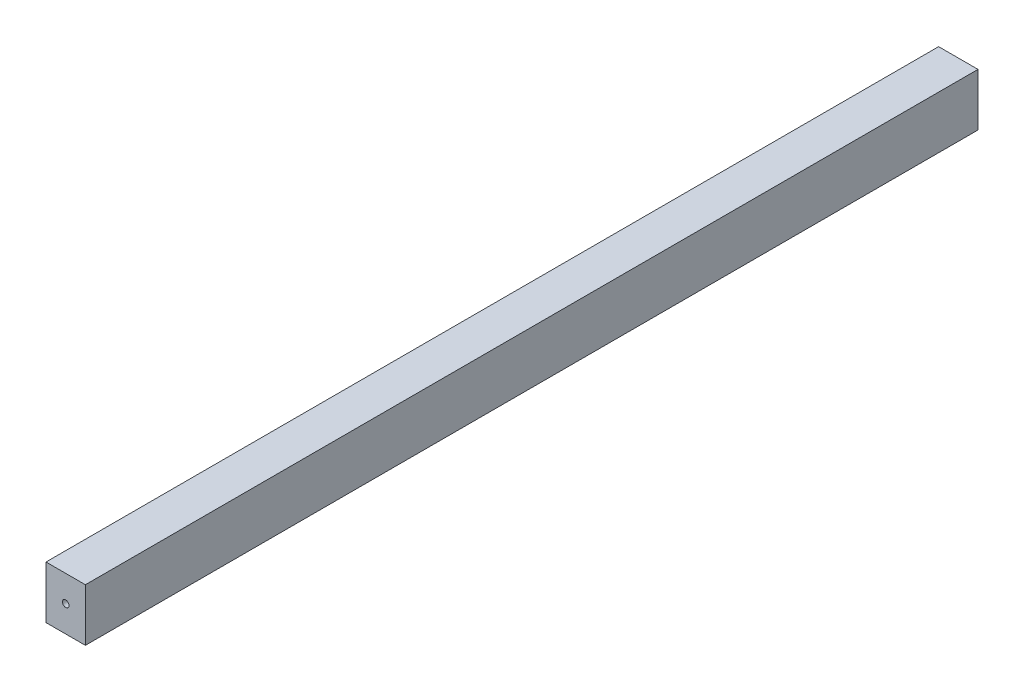
ISO-10303-21;
HEADER;
FILE_DESCRIPTION(('STEP AP214'),'2;1');
FILE_NAME('part.step','',(''),(''),'','','');
FILE_SCHEMA(('AUTOMOTIVE_DESIGN { 1 0 10303 214 1 1 1 1 }'));
ENDSEC;
DATA;
#1=APPLICATION_CONTEXT('core data for automotive mechanical design processes');
#2=APPLICATION_PROTOCOL_DEFINITION('international standard','automotive_design',2000,#1);
#3=PRODUCT_CONTEXT('',#1,'mechanical');
#4=PRODUCT('Part','Part','',(#3));
#5=PRODUCT_RELATED_PRODUCT_CATEGORY('part','',(#4));
#6=PRODUCT_DEFINITION_FORMATION('','',#4);
#7=PRODUCT_DEFINITION_CONTEXT('part definition',#1,'design');
#8=PRODUCT_DEFINITION('design','',#6,#7);
#9=PRODUCT_DEFINITION_SHAPE('','',#8);
#10=(LENGTH_UNIT() NAMED_UNIT(*) SI_UNIT(.MILLI.,.METRE.));
#11=(NAMED_UNIT(*) PLANE_ANGLE_UNIT() SI_UNIT($,.RADIAN.));
#12=(NAMED_UNIT(*) SI_UNIT($,.STERADIAN.) SOLID_ANGLE_UNIT());
#13=UNCERTAINTY_MEASURE_WITH_UNIT(LENGTH_MEASURE(1.E-05),#10,'distance_accuracy_value','');
#14=(GEOMETRIC_REPRESENTATION_CONTEXT(3) GLOBAL_UNCERTAINTY_ASSIGNED_CONTEXT((#13)) GLOBAL_UNIT_ASSIGNED_CONTEXT((#10,
#11,#12)) REPRESENTATION_CONTEXT('',''));
#15=CARTESIAN_POINT('',(0.,0.,0.));
#16=DIRECTION('',(0.,0.,1.));
#17=DIRECTION('',(1.,0.,0.));
#18=AXIS2_PLACEMENT_3D('',#15,#16,#17);
#19=CARTESIAN_POINT('',(0.,0.,863.6));
#20=DIRECTION('',(0.,0.,-1.));
#21=DIRECTION('',(-1.,0.,0.));
#22=AXIS2_PLACEMENT_3D('',#19,#20,#21);
#23=PLANE('',#22);
#24=DIRECTION('',(0.,-1.,0.));
#25=VECTOR('',#24,1.);
#26=CARTESIAN_POINT('',(0.,0.,863.6));
#27=LINE('',#26,#25);
#28=CARTESIAN_POINT('',(0.,50.8,863.6));
#29=VERTEX_POINT('',#28);
#30=CARTESIAN_POINT('',(0.,0.,863.6));
#31=VERTEX_POINT('',#30);
#32=EDGE_CURVE('E92',#29,#31,#27,.T.);
#33=ORIENTED_EDGE('',*,*,#32,.T.);
#34=DIRECTION('',(1.,0.,0.));
#35=VECTOR('',#34,1.);
#36=CARTESIAN_POINT('',(0.,0.,863.6));
#37=LINE('',#36,#35);
#38=CARTESIAN_POINT('',(38.1,0.,863.6));
#39=VERTEX_POINT('',#38);
#40=EDGE_CURVE('E87',#31,#39,#37,.T.);
#41=ORIENTED_EDGE('',*,*,#40,.T.);
#42=DIRECTION('',(0.,1.,0.));
#43=VECTOR('',#42,1.);
#44=CARTESIAN_POINT('',(38.1,0.,863.6));
#45=LINE('',#44,#43);
#46=CARTESIAN_POINT('',(38.1,50.8,863.6));
#47=VERTEX_POINT('',#46);
#48=EDGE_CURVE('E90',#39,#47,#45,.T.);
#49=ORIENTED_EDGE('',*,*,#48,.T.);
#50=DIRECTION('',(-1.,0.,0.));
#51=VECTOR('',#50,1.);
#52=CARTESIAN_POINT('',(0.,50.8,863.6));
#53=LINE('',#52,#51);
#54=EDGE_CURVE('E57',#47,#29,#53,.T.);
#55=ORIENTED_EDGE('',*,*,#54,.T.);
#56=EDGE_LOOP('',(#33,#41,#49,#55));
#57=FACE_BOUND('',#56,.T.);
#58=CARTESIAN_POINT('',(19.05,25.4,863.6));
#59=DIRECTION('',(0.,0.,1.));
#60=DIRECTION('',(1.,0.,0.));
#61=AXIS2_PLACEMENT_3D('',#58,#59,#60);
#62=CIRCLE('',#61,3.175);
#63=CARTESIAN_POINT('',(22.225,25.4,863.6));
#64=VERTEX_POINT('',#63);
#65=EDGE_CURVE('E112',#64,#64,#62,.T.);
#66=ORIENTED_EDGE('',*,*,#65,.F.);
#67=EDGE_LOOP('',(#66));
#68=FACE_BOUND('',#67,.T.);
#69=ADVANCED_FACE('F39',(#57,#68),#23,.F.);
#70=CARTESIAN_POINT('',(0.,0.,0.));
#71=DIRECTION('',(0.,0.,-1.));
#72=DIRECTION('',(-1.,0.,0.));
#73=AXIS2_PLACEMENT_3D('',#70,#71,#72);
#74=PLANE('',#73);
#75=DIRECTION('',(0.,-1.,0.));
#76=VECTOR('',#75,1.);
#77=CARTESIAN_POINT('',(0.,0.,0.));
#78=LINE('',#77,#76);
#79=CARTESIAN_POINT('',(0.,50.8,0.));
#80=VERTEX_POINT('',#79);
#81=CARTESIAN_POINT('',(0.,0.,0.));
#82=VERTEX_POINT('',#81);
#83=EDGE_CURVE('E108',#80,#82,#78,.T.);
#84=ORIENTED_EDGE('',*,*,#83,.F.);
#85=DIRECTION('',(-1.,0.,0.));
#86=VECTOR('',#85,1.);
#87=CARTESIAN_POINT('',(0.,50.8,0.));
#88=LINE('',#87,#86);
#89=CARTESIAN_POINT('',(38.1,50.8,0.));
#90=VERTEX_POINT('',#89);
#91=EDGE_CURVE('E80',#90,#80,#88,.T.);
#92=ORIENTED_EDGE('',*,*,#91,.F.);
#93=DIRECTION('',(0.,1.,0.));
#94=VECTOR('',#93,1.);
#95=CARTESIAN_POINT('',(38.1,0.,0.));
#96=LINE('',#95,#94);
#97=CARTESIAN_POINT('',(38.1,0.,0.));
#98=VERTEX_POINT('',#97);
#99=EDGE_CURVE('E74',#98,#90,#96,.T.);
#100=ORIENTED_EDGE('',*,*,#99,.F.);
#101=DIRECTION('',(1.,0.,0.));
#102=VECTOR('',#101,1.);
#103=CARTESIAN_POINT('',(0.,0.,0.));
#104=LINE('',#103,#102);
#105=EDGE_CURVE('E97',#82,#98,#104,.T.);
#106=ORIENTED_EDGE('',*,*,#105,.F.);
#107=EDGE_LOOP('',(#84,#92,#100,#106));
#108=FACE_BOUND('',#107,.T.);
#109=CARTESIAN_POINT('',(19.05,25.4,0.));
#110=DIRECTION('',(0.,0.,1.));
#111=DIRECTION('',(1.,0.,0.));
#112=AXIS2_PLACEMENT_3D('',#109,#110,#111);
#113=CIRCLE('',#112,3.175);
#114=CARTESIAN_POINT('',(22.225,25.4,0.));
#115=VERTEX_POINT('',#114);
#116=EDGE_CURVE('E130',#115,#115,#113,.T.);
#117=ORIENTED_EDGE('',*,*,#116,.T.);
#118=EDGE_LOOP('',(#117));
#119=FACE_BOUND('',#118,.T.);
#120=ADVANCED_FACE('F125',(#108,#119),#74,.T.);
#121=CARTESIAN_POINT('',(0.,0.,863.6));
#122=DIRECTION('',(1.,0.,0.));
#123=DIRECTION('',(0.,0.,-1.));
#124=AXIS2_PLACEMENT_3D('',#121,#122,#123);
#125=PLANE('',#124);
#126=ORIENTED_EDGE('',*,*,#83,.T.);
#127=DIRECTION('',(0.,0.,-1.));
#128=VECTOR('',#127,1.);
#129=CARTESIAN_POINT('',(0.,0.,863.6));
#130=LINE('',#129,#128);
#131=EDGE_CURVE('E11',#31,#82,#130,.T.);
#132=ORIENTED_EDGE('',*,*,#131,.F.);
#133=ORIENTED_EDGE('',*,*,#32,.F.);
#134=DIRECTION('',(0.,0.,-1.));
#135=VECTOR('',#134,1.);
#136=CARTESIAN_POINT('',(0.,50.8,863.6));
#137=LINE('',#136,#135);
#138=EDGE_CURVE('E104',#29,#80,#137,.T.);
#139=ORIENTED_EDGE('',*,*,#138,.T.);
#140=EDGE_LOOP('',(#126,#132,#133,#139));
#141=FACE_BOUND('',#140,.T.);
#142=ADVANCED_FACE('F41',(#141),#125,.F.);
#143=CARTESIAN_POINT('',(0.,0.,863.6));
#144=DIRECTION('',(0.,1.,0.));
#145=DIRECTION('',(0.,0.,1.));
#146=AXIS2_PLACEMENT_3D('',#143,#144,#145);
#147=PLANE('',#146);
#148=ORIENTED_EDGE('',*,*,#105,.T.);
#149=DIRECTION('',(0.,0.,-1.));
#150=VECTOR('',#149,1.);
#151=CARTESIAN_POINT('',(38.1,0.,863.6));
#152=LINE('',#151,#150);
#153=EDGE_CURVE('E49',#39,#98,#152,.T.);
#154=ORIENTED_EDGE('',*,*,#153,.F.);
#155=ORIENTED_EDGE('',*,*,#40,.F.);
#156=ORIENTED_EDGE('',*,*,#131,.T.);
#157=EDGE_LOOP('',(#148,#154,#155,#156));
#158=FACE_BOUND('',#157,.T.);
#159=ADVANCED_FACE('F96',(#158),#147,.F.);
#160=CARTESIAN_POINT('',(38.1,0.,863.6));
#161=DIRECTION('',(-1.,0.,0.));
#162=DIRECTION('',(0.,0.,1.));
#163=AXIS2_PLACEMENT_3D('',#160,#161,#162);
#164=PLANE('',#163);
#165=ORIENTED_EDGE('',*,*,#99,.T.);
#166=DIRECTION('',(0.,0.,-1.));
#167=VECTOR('',#166,1.);
#168=CARTESIAN_POINT('',(38.1,50.8,863.6));
#169=LINE('',#168,#167);
#170=EDGE_CURVE('E99',#47,#90,#169,.T.);
#171=ORIENTED_EDGE('',*,*,#170,.F.);
#172=ORIENTED_EDGE('',*,*,#48,.F.);
#173=ORIENTED_EDGE('',*,*,#153,.T.);
#174=EDGE_LOOP('',(#165,#171,#172,#173));
#175=FACE_BOUND('',#174,.T.);
#176=ADVANCED_FACE('F100',(#175),#164,.F.);
#177=CARTESIAN_POINT('',(0.,50.8,863.6));
#178=DIRECTION('',(0.,-1.,0.));
#179=DIRECTION('',(0.,0.,-1.));
#180=AXIS2_PLACEMENT_3D('',#177,#178,#179);
#181=PLANE('',#180);
#182=ORIENTED_EDGE('',*,*,#91,.T.);
#183=ORIENTED_EDGE('',*,*,#138,.F.);
#184=ORIENTED_EDGE('',*,*,#54,.F.);
#185=ORIENTED_EDGE('',*,*,#170,.T.);
#186=EDGE_LOOP('',(#182,#183,#184,#185));
#187=FACE_BOUND('',#186,.T.);
#188=ADVANCED_FACE('F122',(#187),#181,.F.);
#189=CARTESIAN_POINT('',(19.05,25.4,863.6));
#190=DIRECTION('',(0.,0.,-1.));
#191=DIRECTION('',(-1.,0.,0.));
#192=AXIS2_PLACEMENT_3D('',#189,#190,#191);
#193=CYLINDRICAL_SURFACE('',#192,3.175);
#194=ORIENTED_EDGE('',*,*,#65,.T.);
#195=EDGE_LOOP('',(#194));
#196=FACE_BOUND('',#195,.T.);
#197=ORIENTED_EDGE('',*,*,#116,.F.);
#198=EDGE_LOOP('',(#197));
#199=FACE_BOUND('',#198,.T.);
#200=ADVANCED_FACE('F138',(#196,#199),#193,.F.);
#201=CLOSED_SHELL('',(#69,#120,#142,#159,#176,#188,#200));
#202=MANIFOLD_SOLID_BREP('B2',#201);
#203=ADVANCED_BREP_SHAPE_REPRESENTATION('',(#18,#202),#14);
#204=SHAPE_DEFINITION_REPRESENTATION(#9,#203);
ENDSEC;
END-ISO-10303-21;
